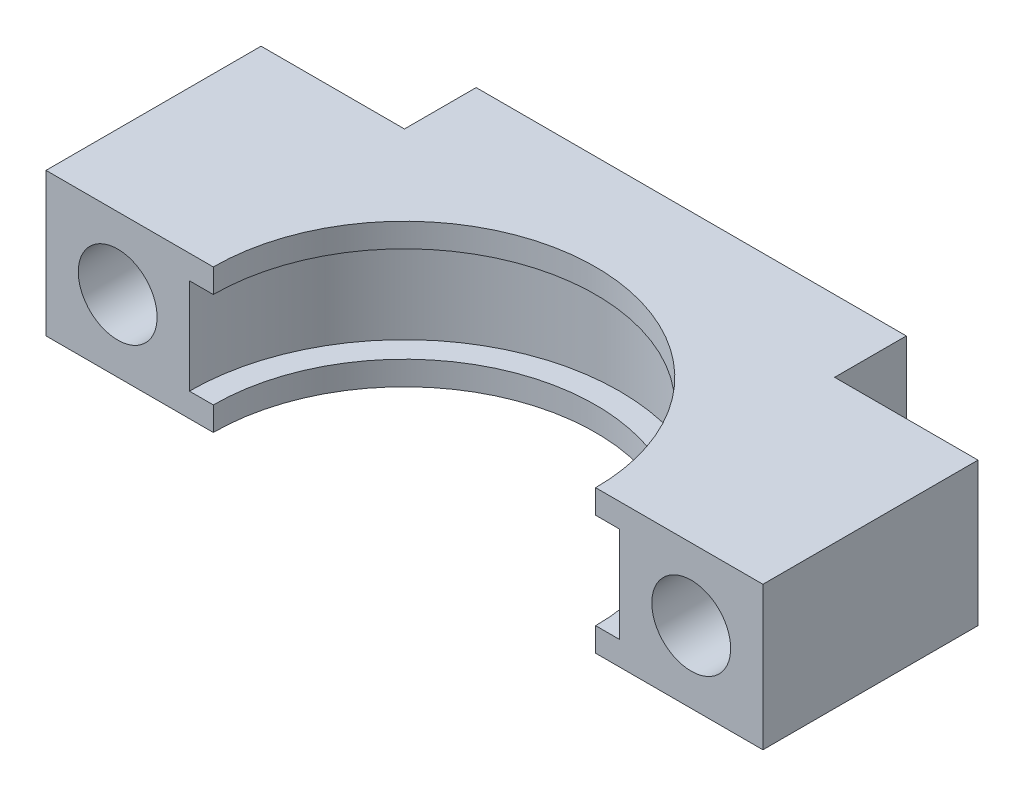
ISO-10303-21;
HEADER;
FILE_DESCRIPTION(('STEP AP214'),'2;1');
FILE_NAME('part.step','',(''),(''),'','','');
FILE_SCHEMA(('AUTOMOTIVE_DESIGN { 1 0 10303 214 1 1 1 1 }'));
ENDSEC;
DATA;
#1=APPLICATION_CONTEXT('core data for automotive mechanical design processes');
#2=APPLICATION_PROTOCOL_DEFINITION('international standard','automotive_design',2000,#1);
#3=PRODUCT_CONTEXT('',#1,'mechanical');
#4=PRODUCT('Part','Part','',(#3));
#5=PRODUCT_RELATED_PRODUCT_CATEGORY('part','',(#4));
#6=PRODUCT_DEFINITION_FORMATION('','',#4);
#7=PRODUCT_DEFINITION_CONTEXT('part definition',#1,'design');
#8=PRODUCT_DEFINITION('design','',#6,#7);
#9=PRODUCT_DEFINITION_SHAPE('','',#8);
#10=(LENGTH_UNIT() NAMED_UNIT(*) SI_UNIT(.MILLI.,.METRE.));
#11=(NAMED_UNIT(*) PLANE_ANGLE_UNIT() SI_UNIT($,.RADIAN.));
#12=(NAMED_UNIT(*) SI_UNIT($,.STERADIAN.) SOLID_ANGLE_UNIT());
#13=UNCERTAINTY_MEASURE_WITH_UNIT(LENGTH_MEASURE(1.E-05),#10,'distance_accuracy_value','');
#14=(GEOMETRIC_REPRESENTATION_CONTEXT(3) GLOBAL_UNCERTAINTY_ASSIGNED_CONTEXT((#13)) GLOBAL_UNIT_ASSIGNED_CONTEXT((#10,
#11,#12)) REPRESENTATION_CONTEXT('',''));
#15=CARTESIAN_POINT('',(0.,0.,0.));
#16=DIRECTION('',(0.,0.,1.));
#17=DIRECTION('',(1.,0.,0.));
#18=AXIS2_PLACEMENT_3D('',#15,#16,#17);
#19=CARTESIAN_POINT('',(-15.,6.,-12.));
#20=DIRECTION('',(0.,0.,1.));
#21=DIRECTION('',(1.,0.,0.));
#22=AXIS2_PLACEMENT_3D('',#19,#20,#21);
#23=PLANE('',#22);
#24=DIRECTION('',(0.,1.,0.));
#25=VECTOR('',#24,1.);
#26=CARTESIAN_POINT('',(-9.,6.,-12.));
#27=LINE('',#26,#25);
#28=CARTESIAN_POINT('',(-9.,0.,-12.));
#29=VERTEX_POINT('',#28);
#30=CARTESIAN_POINT('',(-9.,6.,-12.));
#31=VERTEX_POINT('',#30);
#32=EDGE_CURVE('E145',#29,#31,#27,.T.);
#33=ORIENTED_EDGE('',*,*,#32,.T.);
#34=DIRECTION('',(-1.,0.,0.));
#35=VECTOR('',#34,1.);
#36=CARTESIAN_POINT('',(-15.,6.,-12.));
#37=LINE('',#36,#35);
#38=CARTESIAN_POINT('',(9.,6.,-12.));
#39=VERTEX_POINT('',#38);
#40=EDGE_CURVE('E160',#39,#31,#37,.T.);
#41=ORIENTED_EDGE('',*,*,#40,.F.);
#42=DIRECTION('',(0.,1.,0.));
#43=VECTOR('',#42,1.);
#44=CARTESIAN_POINT('',(9.,6.,-12.));
#45=LINE('',#44,#43);
#46=CARTESIAN_POINT('',(9.,0.,-12.));
#47=VERTEX_POINT('',#46);
#48=EDGE_CURVE('E234',#47,#39,#45,.T.);
#49=ORIENTED_EDGE('',*,*,#48,.F.);
#50=DIRECTION('',(-1.,0.,0.));
#51=VECTOR('',#50,1.);
#52=CARTESIAN_POINT('',(-15.,0.,-12.));
#53=LINE('',#52,#51);
#54=EDGE_CURVE('E172',#47,#29,#53,.T.);
#55=ORIENTED_EDGE('',*,*,#54,.T.);
#56=EDGE_LOOP('',(#33,#41,#49,#55));
#57=FACE_BOUND('',#56,.T.);
#58=ADVANCED_FACE('F35',(#57),#23,.F.);
#59=CARTESIAN_POINT('',(-15.,6.,-12.));
#60=DIRECTION('',(1.,0.,0.));
#61=DIRECTION('',(0.,0.,-1.));
#62=AXIS2_PLACEMENT_3D('',#59,#60,#61);
#63=PLANE('',#62);
#64=DIRECTION('',(0.,-1.,0.));
#65=VECTOR('',#64,1.);
#66=CARTESIAN_POINT('',(-15.,6.,-9.));
#67=LINE('',#66,#65);
#68=CARTESIAN_POINT('',(-15.,6.,-9.));
#69=VERTEX_POINT('',#68);
#70=CARTESIAN_POINT('',(-15.,0.,-9.));
#71=VERTEX_POINT('',#70);
#72=EDGE_CURVE('E135',#69,#71,#67,.T.);
#73=ORIENTED_EDGE('',*,*,#72,.T.);
#74=DIRECTION('',(0.,0.,1.));
#75=VECTOR('',#74,1.);
#76=CARTESIAN_POINT('',(-15.,0.,-12.));
#77=LINE('',#76,#75);
#78=CARTESIAN_POINT('',(-15.,0.,0.));
#79=VERTEX_POINT('',#78);
#80=EDGE_CURVE('E176',#71,#79,#77,.T.);
#81=ORIENTED_EDGE('',*,*,#80,.T.);
#82=DIRECTION('',(0.,-1.,0.));
#83=VECTOR('',#82,1.);
#84=CARTESIAN_POINT('',(-15.,6.,0.));
#85=LINE('',#84,#83);
#86=CARTESIAN_POINT('',(-15.,6.,0.));
#87=VERTEX_POINT('',#86);
#88=EDGE_CURVE('E157',#87,#79,#85,.T.);
#89=ORIENTED_EDGE('',*,*,#88,.F.);
#90=DIRECTION('',(0.,0.,1.));
#91=VECTOR('',#90,1.);
#92=CARTESIAN_POINT('',(-15.,6.,-12.));
#93=LINE('',#92,#91);
#94=EDGE_CURVE('E151',#69,#87,#93,.T.);
#95=ORIENTED_EDGE('',*,*,#94,.F.);
#96=EDGE_LOOP('',(#73,#81,#89,#95));
#97=FACE_BOUND('',#96,.T.);
#98=ADVANCED_FACE('F155',(#97),#63,.F.);
#99=CARTESIAN_POINT('',(0.,6.,0.));
#100=DIRECTION('',(0.,1.,0.));
#101=DIRECTION('',(0.,0.,1.));
#102=AXIS2_PLACEMENT_3D('',#99,#100,#101);
#103=PLANE('',#102);
#104=ORIENTED_EDGE('',*,*,#40,.T.);
#105=DIRECTION('',(0.,0.,-1.));
#106=VECTOR('',#105,1.);
#107=CARTESIAN_POINT('',(-9.,6.,-9.));
#108=LINE('',#107,#106);
#109=CARTESIAN_POINT('',(-9.,6.,-9.));
#110=VERTEX_POINT('',#109);
#111=EDGE_CURVE('E153',#110,#31,#108,.T.);
#112=ORIENTED_EDGE('',*,*,#111,.F.);
#113=DIRECTION('',(-1.,0.,0.));
#114=VECTOR('',#113,1.);
#115=CARTESIAN_POINT('',(-15.,6.,-9.));
#116=LINE('',#115,#114);
#117=EDGE_CURVE('E138',#110,#69,#116,.T.);
#118=ORIENTED_EDGE('',*,*,#117,.T.);
#119=ORIENTED_EDGE('',*,*,#94,.T.);
#120=DIRECTION('',(1.,0.,0.));
#121=VECTOR('',#120,1.);
#122=CARTESIAN_POINT('',(-15.,6.,0.));
#123=LINE('',#122,#121);
#124=CARTESIAN_POINT('',(-8.,6.,0.));
#125=VERTEX_POINT('',#124);
#126=EDGE_CURVE('E162',#87,#125,#123,.T.);
#127=ORIENTED_EDGE('',*,*,#126,.T.);
#128=CARTESIAN_POINT('',(0.,6.,0.));
#129=DIRECTION('',(0.,1.,0.));
#130=DIRECTION('',(0.,0.,1.));
#131=AXIS2_PLACEMENT_3D('',#128,#129,#130);
#132=CIRCLE('',#131,8.);
#133=CARTESIAN_POINT('',(8.,6.,0.));
#134=VERTEX_POINT('',#133);
#135=EDGE_CURVE('E187',#125,#134,#132,.F.);
#136=ORIENTED_EDGE('',*,*,#135,.T.);
#137=CARTESIAN_POINT('',(15.,6.,0.));
#138=VERTEX_POINT('',#137);
#139=EDGE_CURVE('E159',#134,#138,#123,.T.);
#140=ORIENTED_EDGE('',*,*,#139,.T.);
#141=DIRECTION('',(0.,0.,-1.));
#142=VECTOR('',#141,1.);
#143=CARTESIAN_POINT('',(15.,6.,-12.));
#144=LINE('',#143,#142);
#145=CARTESIAN_POINT('',(15.,6.,-9.));
#146=VERTEX_POINT('',#145);
#147=EDGE_CURVE('E164',#138,#146,#144,.T.);
#148=ORIENTED_EDGE('',*,*,#147,.T.);
#149=DIRECTION('',(1.,0.,0.));
#150=VECTOR('',#149,1.);
#151=CARTESIAN_POINT('',(15.,6.,-9.));
#152=LINE('',#151,#150);
#153=CARTESIAN_POINT('',(9.,6.,-9.));
#154=VERTEX_POINT('',#153);
#155=EDGE_CURVE('E230',#154,#146,#152,.T.);
#156=ORIENTED_EDGE('',*,*,#155,.F.);
#157=DIRECTION('',(0.,0.,-1.));
#158=VECTOR('',#157,1.);
#159=CARTESIAN_POINT('',(9.,6.,-9.));
#160=LINE('',#159,#158);
#161=EDGE_CURVE('E247',#154,#39,#160,.T.);
#162=ORIENTED_EDGE('',*,*,#161,.T.);
#163=EDGE_LOOP('',(#104,#112,#118,#119,#127,#136,#140,#148,#156,#162));
#164=FACE_BOUND('',#163,.T.);
#165=ADVANCED_FACE('F149',(#164),#103,.T.);
#166=CARTESIAN_POINT('',(0.,0.,0.));
#167=DIRECTION('',(0.,1.,0.));
#168=DIRECTION('',(0.,0.,1.));
#169=AXIS2_PLACEMENT_3D('',#166,#167,#168);
#170=PLANE('',#169);
#171=DIRECTION('',(0.,0.,-1.));
#172=VECTOR('',#171,1.);
#173=CARTESIAN_POINT('',(-9.,0.,-9.));
#174=LINE('',#173,#172);
#175=CARTESIAN_POINT('',(-9.,0.,-9.));
#176=VERTEX_POINT('',#175);
#177=EDGE_CURVE('E289',#176,#29,#174,.T.);
#178=ORIENTED_EDGE('',*,*,#177,.T.);
#179=ORIENTED_EDGE('',*,*,#54,.F.);
#180=DIRECTION('',(0.,0.,-1.));
#181=VECTOR('',#180,1.);
#182=CARTESIAN_POINT('',(9.,0.,-9.));
#183=LINE('',#182,#181);
#184=CARTESIAN_POINT('',(9.,0.,-9.));
#185=VERTEX_POINT('',#184);
#186=EDGE_CURVE('E245',#185,#47,#183,.T.);
#187=ORIENTED_EDGE('',*,*,#186,.F.);
#188=DIRECTION('',(-1.,0.,0.));
#189=VECTOR('',#188,1.);
#190=CARTESIAN_POINT('',(15.,0.,-9.));
#191=LINE('',#190,#189);
#192=CARTESIAN_POINT('',(15.,0.,-9.));
#193=VERTEX_POINT('',#192);
#194=EDGE_CURVE('E233',#193,#185,#191,.T.);
#195=ORIENTED_EDGE('',*,*,#194,.F.);
#196=DIRECTION('',(0.,0.,-1.));
#197=VECTOR('',#196,1.);
#198=CARTESIAN_POINT('',(15.,0.,-12.));
#199=LINE('',#198,#197);
#200=CARTESIAN_POINT('',(15.,0.,0.));
#201=VERTEX_POINT('',#200);
#202=EDGE_CURVE('E169',#201,#193,#199,.T.);
#203=ORIENTED_EDGE('',*,*,#202,.F.);
#204=DIRECTION('',(1.,0.,0.));
#205=VECTOR('',#204,1.);
#206=CARTESIAN_POINT('',(-15.,0.,0.));
#207=LINE('',#206,#205);
#208=CARTESIAN_POINT('',(8.,0.,0.));
#209=VERTEX_POINT('',#208);
#210=EDGE_CURVE('E178',#209,#201,#207,.T.);
#211=ORIENTED_EDGE('',*,*,#210,.F.);
#212=CARTESIAN_POINT('',(0.,0.,0.));
#213=DIRECTION('',(0.,1.,0.));
#214=DIRECTION('',(0.,0.,1.));
#215=AXIS2_PLACEMENT_3D('',#212,#213,#214);
#216=CIRCLE('',#215,8.);
#217=CARTESIAN_POINT('',(-8.,0.,0.));
#218=VERTEX_POINT('',#217);
#219=EDGE_CURVE('E185',#218,#209,#216,.F.);
#220=ORIENTED_EDGE('',*,*,#219,.F.);
#221=EDGE_CURVE('E179',#79,#218,#207,.T.);
#222=ORIENTED_EDGE('',*,*,#221,.F.);
#223=ORIENTED_EDGE('',*,*,#80,.F.);
#224=DIRECTION('',(1.,0.,0.));
#225=VECTOR('',#224,1.);
#226=CARTESIAN_POINT('',(-15.,0.,-9.));
#227=LINE('',#226,#225);
#228=EDGE_CURVE('E141',#71,#176,#227,.T.);
#229=ORIENTED_EDGE('',*,*,#228,.T.);
#230=EDGE_LOOP('',(#178,#179,#187,#195,#203,#211,#220,#222,#223,#229));
#231=FACE_BOUND('',#230,.T.);
#232=ADVANCED_FACE('F270',(#231),#170,.F.);
#233=CARTESIAN_POINT('',(15.,6.,-12.));
#234=DIRECTION('',(-1.,0.,0.));
#235=DIRECTION('',(0.,0.,1.));
#236=AXIS2_PLACEMENT_3D('',#233,#234,#235);
#237=PLANE('',#236);
#238=DIRECTION('',(0.,-1.,0.));
#239=VECTOR('',#238,1.);
#240=CARTESIAN_POINT('',(15.,6.,-9.));
#241=LINE('',#240,#239);
#242=EDGE_CURVE('E59',#146,#193,#241,.T.);
#243=ORIENTED_EDGE('',*,*,#242,.F.);
#244=ORIENTED_EDGE('',*,*,#147,.F.);
#245=DIRECTION('',(0.,-1.,0.));
#246=VECTOR('',#245,1.);
#247=CARTESIAN_POINT('',(15.,6.,0.));
#248=LINE('',#247,#246);
#249=EDGE_CURVE('E168',#138,#201,#248,.T.);
#250=ORIENTED_EDGE('',*,*,#249,.T.);
#251=ORIENTED_EDGE('',*,*,#202,.T.);
#252=EDGE_LOOP('',(#243,#244,#250,#251));
#253=FACE_BOUND('',#252,.T.);
#254=ADVANCED_FACE('F37',(#253),#237,.F.);
#255=CARTESIAN_POINT('',(-15.,6.,0.));
#256=DIRECTION('',(0.,0.,-1.));
#257=DIRECTION('',(-1.,0.,0.));
#258=AXIS2_PLACEMENT_3D('',#255,#256,#257);
#259=PLANE('',#258);
#260=CARTESIAN_POINT('',(12.,3.,0.));
#261=DIRECTION('',(0.,0.,-1.));
#262=DIRECTION('',(-1.,0.,0.));
#263=AXIS2_PLACEMENT_3D('',#260,#261,#262);
#264=CIRCLE('',#263,1.65);
#265=CARTESIAN_POINT('',(10.35,3.,0.));
#266=VERTEX_POINT('',#265);
#267=EDGE_CURVE('E238',#266,#266,#264,.F.);
#268=ORIENTED_EDGE('',*,*,#267,.F.);
#269=EDGE_LOOP('',(#268));
#270=FACE_BOUND('',#269,.T.);
#271=DIRECTION('',(0.,-1.,0.));
#272=VECTOR('',#271,1.);
#273=CARTESIAN_POINT('',(8.,0.,0.));
#274=LINE('',#273,#272);
#275=CARTESIAN_POINT('',(8.,5.,0.));
#276=VERTEX_POINT('',#275);
#277=EDGE_CURVE('E173',#276,#134,#274,.F.);
#278=ORIENTED_EDGE('',*,*,#277,.F.);
#279=DIRECTION('',(-1.,0.,0.));
#280=VECTOR('',#279,1.);
#281=CARTESIAN_POINT('',(-15.,5.,0.));
#282=LINE('',#281,#280);
#283=CARTESIAN_POINT('',(9.,5.,0.));
#284=VERTEX_POINT('',#283);
#285=EDGE_CURVE('E11',#284,#276,#282,.T.);
#286=ORIENTED_EDGE('',*,*,#285,.F.);
#287=DIRECTION('',(0.,-1.,0.));
#288=VECTOR('',#287,1.);
#289=CARTESIAN_POINT('',(9.,0.,0.));
#290=LINE('',#289,#288);
#291=CARTESIAN_POINT('',(9.,1.,0.));
#292=VERTEX_POINT('',#291);
#293=EDGE_CURVE('E39',#292,#284,#290,.F.);
#294=ORIENTED_EDGE('',*,*,#293,.F.);
#295=DIRECTION('',(1.,0.,0.));
#296=VECTOR('',#295,1.);
#297=CARTESIAN_POINT('',(-15.,1.,0.));
#298=LINE('',#297,#296);
#299=CARTESIAN_POINT('',(8.,1.,0.));
#300=VERTEX_POINT('',#299);
#301=EDGE_CURVE('E193',#300,#292,#298,.T.);
#302=ORIENTED_EDGE('',*,*,#301,.F.);
#303=DIRECTION('',(0.,-1.,0.));
#304=VECTOR('',#303,1.);
#305=CARTESIAN_POINT('',(8.,0.,0.));
#306=LINE('',#305,#304);
#307=EDGE_CURVE('E223',#209,#300,#306,.F.);
#308=ORIENTED_EDGE('',*,*,#307,.F.);
#309=ORIENTED_EDGE('',*,*,#210,.T.);
#310=ORIENTED_EDGE('',*,*,#249,.F.);
#311=ORIENTED_EDGE('',*,*,#139,.F.);
#312=EDGE_LOOP('',(#278,#286,#294,#302,#308,#309,#310,#311));
#313=FACE_BOUND('',#312,.T.);
#314=ADVANCED_FACE('F217',(#270,#313),#259,.F.);
#315=CARTESIAN_POINT('',(-12.,3.,0.));
#316=DIRECTION('',(0.,0.,-1.));
#317=DIRECTION('',(-1.,0.,0.));
#318=AXIS2_PLACEMENT_3D('',#315,#316,#317);
#319=CIRCLE('',#318,1.65);
#320=CARTESIAN_POINT('',(-13.65,3.,0.));
#321=VERTEX_POINT('',#320);
#322=EDGE_CURVE('E284',#321,#321,#319,.T.);
#323=ORIENTED_EDGE('',*,*,#322,.T.);
#324=EDGE_LOOP('',(#323));
#325=FACE_BOUND('',#324,.T.);
#326=DIRECTION('',(0.,-1.,0.));
#327=VECTOR('',#326,1.);
#328=CARTESIAN_POINT('',(-8.,0.,0.));
#329=LINE('',#328,#327);
#330=CARTESIAN_POINT('',(-8.,5.,0.));
#331=VERTEX_POINT('',#330);
#332=EDGE_CURVE('E221',#125,#331,#329,.T.);
#333=ORIENTED_EDGE('',*,*,#332,.F.);
#334=ORIENTED_EDGE('',*,*,#126,.F.);
#335=ORIENTED_EDGE('',*,*,#88,.T.);
#336=ORIENTED_EDGE('',*,*,#221,.T.);
#337=DIRECTION('',(0.,-1.,0.));
#338=VECTOR('',#337,1.);
#339=CARTESIAN_POINT('',(-8.,0.,0.));
#340=LINE('',#339,#338);
#341=CARTESIAN_POINT('',(-8.,1.,0.));
#342=VERTEX_POINT('',#341);
#343=EDGE_CURVE('E254',#342,#218,#340,.T.);
#344=ORIENTED_EDGE('',*,*,#343,.F.);
#345=CARTESIAN_POINT('',(-9.,1.,0.));
#346=VERTEX_POINT('',#345);
#347=EDGE_CURVE('E190',#346,#342,#298,.T.);
#348=ORIENTED_EDGE('',*,*,#347,.F.);
#349=DIRECTION('',(0.,-1.,0.));
#350=VECTOR('',#349,1.);
#351=CARTESIAN_POINT('',(-9.,0.,0.));
#352=LINE('',#351,#350);
#353=CARTESIAN_POINT('',(-9.,5.,0.));
#354=VERTEX_POINT('',#353);
#355=EDGE_CURVE('E192',#354,#346,#352,.T.);
#356=ORIENTED_EDGE('',*,*,#355,.F.);
#357=EDGE_CURVE('E44',#331,#354,#282,.T.);
#358=ORIENTED_EDGE('',*,*,#357,.F.);
#359=EDGE_LOOP('',(#333,#334,#335,#336,#344,#348,#356,#358));
#360=FACE_BOUND('',#359,.T.);
#361=ADVANCED_FACE('F266',(#325,#360),#259,.F.);
#362=CARTESIAN_POINT('',(0.,5.,0.));
#363=DIRECTION('',(0.,-1.,0.));
#364=DIRECTION('',(0.,0.,-1.));
#365=AXIS2_PLACEMENT_3D('',#362,#363,#364);
#366=PLANE('',#365);
#367=ORIENTED_EDGE('',*,*,#285,.T.);
#368=CARTESIAN_POINT('',(0.,5.,0.));
#369=DIRECTION('',(0.,-1.,0.));
#370=DIRECTION('',(0.,0.,-1.));
#371=AXIS2_PLACEMENT_3D('',#368,#369,#370);
#372=CIRCLE('',#371,8.);
#373=EDGE_CURVE('E214',#331,#276,#372,.T.);
#374=ORIENTED_EDGE('',*,*,#373,.F.);
#375=ORIENTED_EDGE('',*,*,#357,.T.);
#376=CARTESIAN_POINT('',(0.,5.,0.));
#377=DIRECTION('',(0.,-1.,0.));
#378=DIRECTION('',(0.,0.,-1.));
#379=AXIS2_PLACEMENT_3D('',#376,#377,#378);
#380=CIRCLE('',#379,9.);
#381=EDGE_CURVE('E207',#354,#284,#380,.T.);
#382=ORIENTED_EDGE('',*,*,#381,.T.);
#383=EDGE_LOOP('',(#367,#374,#375,#382));
#384=FACE_BOUND('',#383,.T.);
#385=ADVANCED_FACE('F212',(#384),#366,.T.);
#386=CARTESIAN_POINT('',(0.,0.,0.));
#387=DIRECTION('',(0.,-1.,0.));
#388=DIRECTION('',(0.,0.,-1.));
#389=AXIS2_PLACEMENT_3D('',#386,#387,#388);
#390=CYLINDRICAL_SURFACE('',#389,9.);
#391=ORIENTED_EDGE('',*,*,#293,.T.);
#392=ORIENTED_EDGE('',*,*,#381,.F.);
#393=ORIENTED_EDGE('',*,*,#355,.T.);
#394=CARTESIAN_POINT('',(0.,1.,0.));
#395=DIRECTION('',(0.,-1.,0.));
#396=DIRECTION('',(0.,0.,-1.));
#397=AXIS2_PLACEMENT_3D('',#394,#395,#396);
#398=CIRCLE('',#397,9.);
#399=EDGE_CURVE('E209',#346,#292,#398,.T.);
#400=ORIENTED_EDGE('',*,*,#399,.T.);
#401=EDGE_LOOP('',(#391,#392,#393,#400));
#402=FACE_BOUND('',#401,.T.);
#403=ADVANCED_FACE('F206',(#402),#390,.F.);
#404=CARTESIAN_POINT('',(0.,1.,0.));
#405=DIRECTION('',(0.,1.,0.));
#406=DIRECTION('',(0.,0.,1.));
#407=AXIS2_PLACEMENT_3D('',#404,#405,#406);
#408=PLANE('',#407);
#409=ORIENTED_EDGE('',*,*,#347,.T.);
#410=CARTESIAN_POINT('',(0.,1.,0.));
#411=DIRECTION('',(0.,-1.,0.));
#412=DIRECTION('',(0.,0.,-1.));
#413=AXIS2_PLACEMENT_3D('',#410,#411,#412);
#414=CIRCLE('',#413,8.);
#415=EDGE_CURVE('E249',#342,#300,#414,.T.);
#416=ORIENTED_EDGE('',*,*,#415,.T.);
#417=ORIENTED_EDGE('',*,*,#301,.T.);
#418=ORIENTED_EDGE('',*,*,#399,.F.);
#419=EDGE_LOOP('',(#409,#416,#417,#418));
#420=FACE_BOUND('',#419,.T.);
#421=ADVANCED_FACE('F262',(#420),#408,.T.);
#422=CARTESIAN_POINT('',(0.,0.,0.));
#423=DIRECTION('',(0.,-1.,0.));
#424=DIRECTION('',(0.,0.,-1.));
#425=AXIS2_PLACEMENT_3D('',#422,#423,#424);
#426=CYLINDRICAL_SURFACE('',#425,8.);
#427=ORIENTED_EDGE('',*,*,#277,.T.);
#428=ORIENTED_EDGE('',*,*,#135,.F.);
#429=ORIENTED_EDGE('',*,*,#332,.T.);
#430=ORIENTED_EDGE('',*,*,#373,.T.);
#431=EDGE_LOOP('',(#427,#428,#429,#430));
#432=FACE_BOUND('',#431,.T.);
#433=ADVANCED_FACE('F321',(#432),#426,.F.);
#434=CARTESIAN_POINT('',(0.,0.,0.));
#435=DIRECTION('',(0.,-1.,0.));
#436=DIRECTION('',(0.,0.,-1.));
#437=AXIS2_PLACEMENT_3D('',#434,#435,#436);
#438=CYLINDRICAL_SURFACE('',#437,8.);
#439=ORIENTED_EDGE('',*,*,#307,.T.);
#440=ORIENTED_EDGE('',*,*,#415,.F.);
#441=ORIENTED_EDGE('',*,*,#343,.T.);
#442=ORIENTED_EDGE('',*,*,#219,.T.);
#443=EDGE_LOOP('',(#439,#440,#441,#442));
#444=FACE_BOUND('',#443,.T.);
#445=ADVANCED_FACE('F258',(#444),#438,.F.);
#446=CARTESIAN_POINT('',(9.,6.,-9.));
#447=DIRECTION('',(-1.,0.,0.));
#448=DIRECTION('',(0.,0.,1.));
#449=AXIS2_PLACEMENT_3D('',#446,#447,#448);
#450=PLANE('',#449);
#451=ORIENTED_EDGE('',*,*,#48,.T.);
#452=ORIENTED_EDGE('',*,*,#161,.F.);
#453=DIRECTION('',(0.,1.,0.));
#454=VECTOR('',#453,1.);
#455=CARTESIAN_POINT('',(9.,6.,-9.));
#456=LINE('',#455,#454);
#457=EDGE_CURVE('E236',#185,#154,#456,.T.);
#458=ORIENTED_EDGE('',*,*,#457,.F.);
#459=ORIENTED_EDGE('',*,*,#186,.T.);
#460=EDGE_LOOP('',(#451,#452,#458,#459));
#461=FACE_BOUND('',#460,.T.);
#462=ADVANCED_FACE('F275',(#461),#450,.F.);
#463=CARTESIAN_POINT('',(0.,0.,-9.));
#464=DIRECTION('',(0.,0.,-1.));
#465=DIRECTION('',(-1.,0.,0.));
#466=AXIS2_PLACEMENT_3D('',#463,#464,#465);
#467=PLANE('',#466);
#468=CARTESIAN_POINT('',(12.,3.,-9.));
#469=DIRECTION('',(0.,0.,-1.));
#470=DIRECTION('',(-1.,0.,0.));
#471=AXIS2_PLACEMENT_3D('',#468,#469,#470);
#472=CIRCLE('',#471,1.65);
#473=CARTESIAN_POINT('',(10.35,3.,-9.));
#474=VERTEX_POINT('',#473);
#475=EDGE_CURVE('E291',#474,#474,#472,.T.);
#476=ORIENTED_EDGE('',*,*,#475,.F.);
#477=EDGE_LOOP('',(#476));
#478=FACE_BOUND('',#477,.T.);
#479=ORIENTED_EDGE('',*,*,#242,.T.);
#480=ORIENTED_EDGE('',*,*,#194,.T.);
#481=ORIENTED_EDGE('',*,*,#457,.T.);
#482=ORIENTED_EDGE('',*,*,#155,.T.);
#483=EDGE_LOOP('',(#479,#480,#481,#482));
#484=FACE_BOUND('',#483,.T.);
#485=ADVANCED_FACE('F273',(#478,#484),#467,.T.);
#486=CARTESIAN_POINT('',(12.,3.,0.000999999999999265));
#487=DIRECTION('',(0.,0.,-1.));
#488=DIRECTION('',(-1.,0.,0.));
#489=AXIS2_PLACEMENT_3D('',#486,#487,#488);
#490=CYLINDRICAL_SURFACE('',#489,1.65);
#491=ORIENTED_EDGE('',*,*,#475,.T.);
#492=EDGE_LOOP('',(#491));
#493=FACE_BOUND('',#492,.T.);
#494=ORIENTED_EDGE('',*,*,#267,.T.);
#495=EDGE_LOOP('',(#494));
#496=FACE_BOUND('',#495,.T.);
#497=ADVANCED_FACE('F298',(#493,#496),#490,.F.);
#498=CARTESIAN_POINT('',(-9.,6.,-9.));
#499=DIRECTION('',(-1.,0.,0.));
#500=DIRECTION('',(0.,0.,1.));
#501=AXIS2_PLACEMENT_3D('',#498,#499,#500);
#502=PLANE('',#501);
#503=ORIENTED_EDGE('',*,*,#32,.F.);
#504=ORIENTED_EDGE('',*,*,#177,.F.);
#505=DIRECTION('',(0.,1.,0.));
#506=VECTOR('',#505,1.);
#507=CARTESIAN_POINT('',(-9.,6.,-9.));
#508=LINE('',#507,#506);
#509=EDGE_CURVE('E51',#176,#110,#508,.T.);
#510=ORIENTED_EDGE('',*,*,#509,.T.);
#511=ORIENTED_EDGE('',*,*,#111,.T.);
#512=EDGE_LOOP('',(#503,#504,#510,#511));
#513=FACE_BOUND('',#512,.T.);
#514=ADVANCED_FACE('F339',(#513),#502,.T.);
#515=CARTESIAN_POINT('',(0.,0.,-9.));
#516=DIRECTION('',(0.,0.,-1.));
#517=DIRECTION('',(1.,0.,0.));
#518=AXIS2_PLACEMENT_3D('',#515,#516,#517);
#519=PLANE('',#518);
#520=CARTESIAN_POINT('',(-12.,3.,-9.));
#521=DIRECTION('',(0.,0.,1.));
#522=DIRECTION('',(1.,0.,0.));
#523=AXIS2_PLACEMENT_3D('',#520,#521,#522);
#524=CIRCLE('',#523,1.65);
#525=CARTESIAN_POINT('',(-10.35,3.,-9.));
#526=VERTEX_POINT('',#525);
#527=EDGE_CURVE('E281',#526,#526,#524,.T.);
#528=ORIENTED_EDGE('',*,*,#527,.T.);
#529=EDGE_LOOP('',(#528));
#530=FACE_BOUND('',#529,.T.);
#531=ORIENTED_EDGE('',*,*,#72,.F.);
#532=ORIENTED_EDGE('',*,*,#117,.F.);
#533=ORIENTED_EDGE('',*,*,#509,.F.);
#534=ORIENTED_EDGE('',*,*,#228,.F.);
#535=EDGE_LOOP('',(#531,#532,#533,#534));
#536=FACE_BOUND('',#535,.T.);
#537=ADVANCED_FACE('F137',(#530,#536),#519,.T.);
#538=CARTESIAN_POINT('',(-12.,3.,0.000999999999999265));
#539=DIRECTION('',(0.,0.,-1.));
#540=DIRECTION('',(-1.,0.,0.));
#541=AXIS2_PLACEMENT_3D('',#538,#539,#540);
#542=CYLINDRICAL_SURFACE('',#541,1.65);
#543=ORIENTED_EDGE('',*,*,#527,.F.);
#544=EDGE_LOOP('',(#543));
#545=FACE_BOUND('',#544,.T.);
#546=ORIENTED_EDGE('',*,*,#322,.F.);
#547=EDGE_LOOP('',(#546));
#548=FACE_BOUND('',#547,.T.);
#549=ADVANCED_FACE('F344',(#545,#548),#542,.F.);
#550=CLOSED_SHELL('',(#58,#98,#165,#232,#254,#314,#361,#385,#403,#421,#433,#445,#462,#485,#497,
#514,#537,#549));
#551=MANIFOLD_SOLID_BREP('B2',#550);
#552=ADVANCED_BREP_SHAPE_REPRESENTATION('',(#18,#551),#14);
#553=SHAPE_DEFINITION_REPRESENTATION(#9,#552);
ENDSEC;
END-ISO-10303-21;
